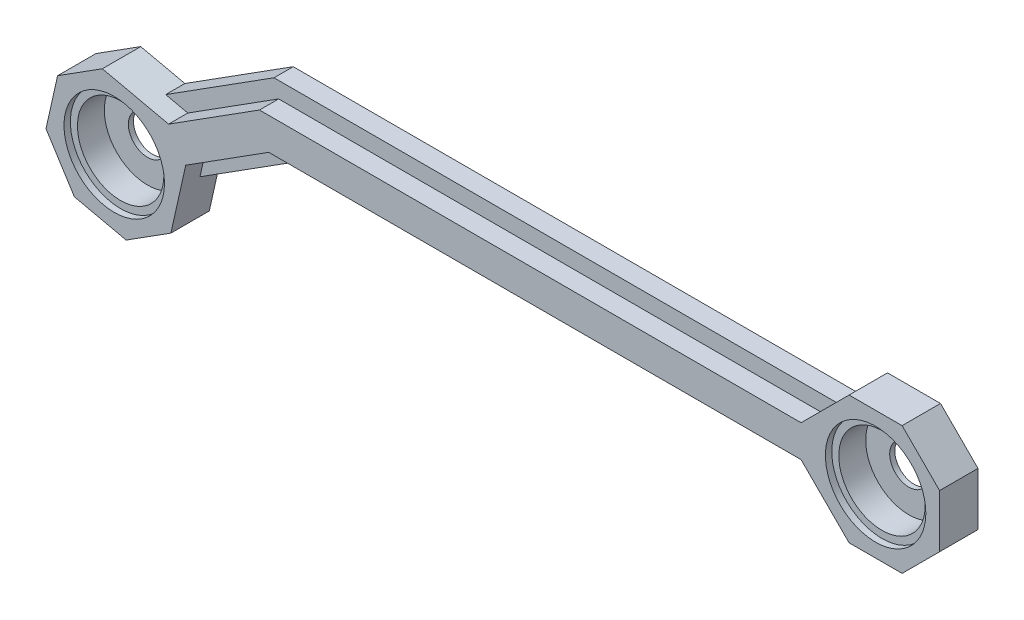
ISO-10303-21;
HEADER;
FILE_DESCRIPTION(('STEP AP214'),'2;1');
FILE_NAME('part.step','',(''),(''),'','','');
FILE_SCHEMA(('AUTOMOTIVE_DESIGN { 1 0 10303 214 1 1 1 1 }'));
ENDSEC;
DATA;
#1=APPLICATION_CONTEXT('core data for automotive mechanical design processes');
#2=APPLICATION_PROTOCOL_DEFINITION('international standard','automotive_design',2000,#1);
#3=PRODUCT_CONTEXT('',#1,'mechanical');
#4=PRODUCT('Part','Part','',(#3));
#5=PRODUCT_RELATED_PRODUCT_CATEGORY('part','',(#4));
#6=PRODUCT_DEFINITION_FORMATION('','',#4);
#7=PRODUCT_DEFINITION_CONTEXT('part definition',#1,'design');
#8=PRODUCT_DEFINITION('design','',#6,#7);
#9=PRODUCT_DEFINITION_SHAPE('','',#8);
#10=(LENGTH_UNIT() NAMED_UNIT(*) SI_UNIT(.MILLI.,.METRE.));
#11=(NAMED_UNIT(*) PLANE_ANGLE_UNIT() SI_UNIT($,.RADIAN.));
#12=(NAMED_UNIT(*) SI_UNIT($,.STERADIAN.) SOLID_ANGLE_UNIT());
#13=UNCERTAINTY_MEASURE_WITH_UNIT(LENGTH_MEASURE(1.E-05),#10,'distance_accuracy_value','');
#14=(GEOMETRIC_REPRESENTATION_CONTEXT(3) GLOBAL_UNCERTAINTY_ASSIGNED_CONTEXT((#13)) GLOBAL_UNIT_ASSIGNED_CONTEXT((#10,
#11,#12)) REPRESENTATION_CONTEXT('',''));
#15=CARTESIAN_POINT('',(0.,0.,0.));
#16=DIRECTION('',(0.,0.,1.));
#17=DIRECTION('',(1.,0.,0.));
#18=AXIS2_PLACEMENT_3D('',#15,#16,#17);
#19=CARTESIAN_POINT('',(-97.0021611343395,4.99999999999999,-3.));
#20=DIRECTION('',(-0.535679423795969,0.84442143205962,0.));
#21=DIRECTION('',(-0.84442143205962,-0.535679423795969,0.));
#22=AXIS2_PLACEMENT_3D('',#19,#20,#21);
#23=PLANE('',#22);
#24=DIRECTION('',(0.,0.,1.));
#25=VECTOR('',#24,1.);
#26=CARTESIAN_POINT('',(-113.924993650639,-5.7354134169905,-3.));
#27=LINE('',#26,#25);
#28=CARTESIAN_POINT('',(-113.924993650639,-5.73541341699053,-6.));
#29=VERTEX_POINT('',#28);
#30=CARTESIAN_POINT('',(-113.924993650639,-5.73541341699053,-3.));
#31=VERTEX_POINT('',#30);
#32=EDGE_CURVE('E396',#29,#31,#27,.T.);
#33=ORIENTED_EDGE('',*,*,#32,.T.);
#34=DIRECTION('',(-0.844421432059619,-0.535679423795969,0.));
#35=VECTOR('',#34,1.);
#36=CARTESIAN_POINT('',(-30.0967032462192,47.4431163985229,-3.));
#37=LINE('',#36,#35);
#38=CARTESIAN_POINT('',(-97.0021611343395,4.99999999999999,-3.));
#39=VERTEX_POINT('',#38);
#40=EDGE_CURVE('E307',#39,#31,#37,.T.);
#41=ORIENTED_EDGE('',*,*,#40,.F.);
#42=DIRECTION('',(0.,0.,1.));
#43=VECTOR('',#42,1.);
#44=CARTESIAN_POINT('',(-97.0021611343395,4.99999999999999,-3.));
#45=LINE('',#44,#43);
#46=CARTESIAN_POINT('',(-97.0021611343395,4.99999999999999,-6.));
#47=VERTEX_POINT('',#46);
#48=EDGE_CURVE('E404',#47,#39,#45,.T.);
#49=ORIENTED_EDGE('',*,*,#48,.F.);
#50=DIRECTION('',(0.844421432059619,0.53567942379597,0.));
#51=VECTOR('',#50,1.);
#52=CARTESIAN_POINT('',(-113.924993650639,-5.73541341699053,-6.));
#53=LINE('',#52,#51);
#54=EDGE_CURVE('E346',#29,#47,#53,.T.);
#55=ORIENTED_EDGE('',*,*,#54,.F.);
#56=EDGE_LOOP('',(#33,#41,#49,#55));
#57=FACE_BOUND('',#56,.T.);
#58=ADVANCED_FACE('F91',(#57),#23,.T.);
#59=CARTESIAN_POINT('',(-9.14213562373094,5.00000000000001,-3.));
#60=DIRECTION('',(0.,1.,0.));
#61=DIRECTION('',(-1.,0.,0.));
#62=AXIS2_PLACEMENT_3D('',#59,#60,#61);
#63=PLANE('',#62);
#64=ORIENTED_EDGE('',*,*,#48,.T.);
#65=DIRECTION('',(-1.,0.,0.));
#66=VECTOR('',#65,1.);
#67=CARTESIAN_POINT('',(0.,5.,-3.));
#68=LINE('',#67,#66);
#69=CARTESIAN_POINT('',(-9.14213562373094,5.00000000000001,-3.));
#70=VERTEX_POINT('',#69);
#71=EDGE_CURVE('E304',#70,#39,#68,.T.);
#72=ORIENTED_EDGE('',*,*,#71,.F.);
#73=DIRECTION('',(0.,0.,1.));
#74=VECTOR('',#73,1.);
#75=CARTESIAN_POINT('',(-9.14213562373094,5.00000000000001,-3.));
#76=LINE('',#75,#74);
#77=CARTESIAN_POINT('',(-9.14213562373094,5.,-6.));
#78=VERTEX_POINT('',#77);
#79=EDGE_CURVE('E409',#78,#70,#76,.T.);
#80=ORIENTED_EDGE('',*,*,#79,.F.);
#81=DIRECTION('',(1.,0.,0.));
#82=VECTOR('',#81,1.);
#83=CARTESIAN_POINT('',(-97.0021611343395,4.99999999999999,-6.));
#84=LINE('',#83,#82);
#85=EDGE_CURVE('E336',#47,#78,#84,.T.);
#86=ORIENTED_EDGE('',*,*,#85,.F.);
#87=EDGE_LOOP('',(#64,#72,#80,#86));
#88=FACE_BOUND('',#87,.T.);
#89=ADVANCED_FACE('F586',(#88),#63,.T.);
#90=CARTESIAN_POINT('',(-94.0978388656604,-4.99999999999999,-3.));
#91=DIRECTION('',(0.535679423795973,-0.844421432059617,0.));
#92=DIRECTION('',(0.844421432059617,0.535679423795973,0.));
#93=AXIS2_PLACEMENT_3D('',#90,#91,#92);
#94=PLANE('',#93);
#95=DIRECTION('',(0.,0.,1.));
#96=VECTOR('',#95,1.);
#97=CARTESIAN_POINT('',(-94.0978388656604,-4.99999999999999,-3.));
#98=LINE('',#97,#96);
#99=CARTESIAN_POINT('',(-94.0978388656604,-4.99999999999999,-6.));
#100=VERTEX_POINT('',#99);
#101=CARTESIAN_POINT('',(-94.0978388656604,-4.99999999999999,-3.));
#102=VERTEX_POINT('',#101);
#103=EDGE_CURVE('E391',#100,#102,#98,.T.);
#104=ORIENTED_EDGE('',*,*,#103,.T.);
#105=DIRECTION('',(0.844421432059617,0.535679423795973,0.));
#106=VECTOR('',#105,1.);
#107=CARTESIAN_POINT('',(-24.7399090082598,38.9989020779268,-3.));
#108=LINE('',#107,#106);
#109=CARTESIAN_POINT('',(-108.56819941268,-14.1796277375867,-3.));
#110=VERTEX_POINT('',#109);
#111=EDGE_CURVE('E117',#110,#102,#108,.T.);
#112=ORIENTED_EDGE('',*,*,#111,.F.);
#113=DIRECTION('',(0.,0.,1.));
#114=VECTOR('',#113,1.);
#115=CARTESIAN_POINT('',(-108.56819941268,-14.1796277375867,-3.));
#116=LINE('',#115,#114);
#117=CARTESIAN_POINT('',(-108.56819941268,-14.1796277375867,-6.));
#118=VERTEX_POINT('',#117);
#119=EDGE_CURVE('E392',#118,#110,#116,.T.);
#120=ORIENTED_EDGE('',*,*,#119,.F.);
#121=DIRECTION('',(-0.844421432059617,-0.535679423795973,0.));
#122=VECTOR('',#121,1.);
#123=CARTESIAN_POINT('',(-108.56819941268,-14.1796277375867,-6.));
#124=LINE('',#123,#122);
#125=EDGE_CURVE('E354',#100,#118,#124,.T.);
#126=ORIENTED_EDGE('',*,*,#125,.F.);
#127=EDGE_LOOP('',(#104,#112,#120,#126));
#128=FACE_BOUND('',#127,.T.);
#129=ADVANCED_FACE('F592',(#128),#94,.T.);
#130=CARTESIAN_POINT('',(-9.14213562373094,-5.00000000000001,-3.));
#131=DIRECTION('',(0.,-1.,0.));
#132=DIRECTION('',(1.,0.,0.));
#133=AXIS2_PLACEMENT_3D('',#130,#131,#132);
#134=PLANE('',#133);
#135=DIRECTION('',(0.,0.,1.));
#136=VECTOR('',#135,1.);
#137=CARTESIAN_POINT('',(-9.14213562373094,-5.00000000000001,-3.));
#138=LINE('',#137,#136);
#139=CARTESIAN_POINT('',(-9.14213562373094,-5.,-6.));
#140=VERTEX_POINT('',#139);
#141=CARTESIAN_POINT('',(-9.14213562373094,-5.,-3.));
#142=VERTEX_POINT('',#141);
#143=EDGE_CURVE('E397',#140,#142,#138,.T.);
#144=ORIENTED_EDGE('',*,*,#143,.T.);
#145=DIRECTION('',(1.,0.,0.));
#146=VECTOR('',#145,1.);
#147=CARTESIAN_POINT('',(0.,-5.00000000000001,-3.));
#148=LINE('',#147,#146);
#149=EDGE_CURVE('E291',#102,#142,#148,.T.);
#150=ORIENTED_EDGE('',*,*,#149,.F.);
#151=ORIENTED_EDGE('',*,*,#103,.F.);
#152=DIRECTION('',(-1.,0.,0.));
#153=VECTOR('',#152,1.);
#154=CARTESIAN_POINT('',(-94.0978388656604,-4.99999999999999,-6.));
#155=LINE('',#154,#153);
#156=EDGE_CURVE('E350',#140,#100,#155,.T.);
#157=ORIENTED_EDGE('',*,*,#156,.F.);
#158=EDGE_LOOP('',(#144,#150,#151,#157));
#159=FACE_BOUND('',#158,.T.);
#160=ADVANCED_FACE('F634',(#159),#134,.T.);
#161=CARTESIAN_POINT('',(-6.65167371830106,-29.7335002875948,-6.));
#162=DIRECTION('',(-0.218313567680371,-0.975878673896847,0.));
#163=DIRECTION('',(0.975878673896847,-0.218313567680371,0.));
#164=AXIS2_PLACEMENT_3D('',#161,#162,#163);
#165=PLANE('',#164);
#166=ORIENTED_EDGE('',*,*,#32,.F.);
#167=DIRECTION('',(0.975878673896847,-0.218313567680371,0.));
#168=VECTOR('',#167,1.);
#169=CARTESIAN_POINT('',(-6.65167371830106,-29.7335002875948,-6.));
#170=LINE('',#169,#168);
#171=CARTESIAN_POINT('',(-120.825497929917,-4.19170337567234,-6.));
#172=VERTEX_POINT('',#171);
#173=EDGE_CURVE('E445',#172,#29,#170,.T.);
#174=ORIENTED_EDGE('',*,*,#173,.F.);
#175=DIRECTION('',(0.,0.,1.));
#176=VECTOR('',#175,1.);
#177=CARTESIAN_POINT('',(-120.825497929917,-4.19170337567234,-6.));
#178=LINE('',#177,#176);
#179=CARTESIAN_POINT('',(-120.825497929917,-4.19170337567234,0.));
#180=VERTEX_POINT('',#179);
#181=EDGE_CURVE('E535',#172,#180,#178,.T.);
#182=ORIENTED_EDGE('',*,*,#181,.T.);
#183=DIRECTION('',(0.975878673896847,-0.218313567680371,0.));
#184=VECTOR('',#183,1.);
#185=CARTESIAN_POINT('',(-6.65167371830106,-29.7335002875948,0.));
#186=LINE('',#185,#184);
#187=CARTESIAN_POINT('',(-110.474741511,-6.50726843764966,0.));
#188=VERTEX_POINT('',#187);
#189=EDGE_CURVE('E499',#180,#188,#186,.T.);
#190=ORIENTED_EDGE('',*,*,#189,.T.);
#191=DIRECTION('',(0.,0.,1.));
#192=VECTOR('',#191,1.);
#193=CARTESIAN_POINT('',(-110.474741511,-6.50726843764966,-3.));
#194=LINE('',#193,#192);
#195=CARTESIAN_POINT('',(-110.474741511,-6.50726843764966,-3.));
#196=VERTEX_POINT('',#195);
#197=EDGE_CURVE('E325',#196,#188,#194,.T.);
#198=ORIENTED_EDGE('',*,*,#197,.F.);
#199=DIRECTION('',(0.975878673896847,-0.218313567680371,0.));
#200=VECTOR('',#199,1.);
#201=CARTESIAN_POINT('',(-6.65167371830105,-29.7335002875948,-3.));
#202=LINE('',#201,#200);
#203=EDGE_CURVE('E312',#31,#196,#202,.T.);
#204=ORIENTED_EDGE('',*,*,#203,.F.);
#205=EDGE_LOOP('',(#166,#174,#182,#190,#198,#204));
#206=FACE_BOUND('',#205,.T.);
#207=ADVANCED_FACE('F631',(#206),#165,.F.);
#208=CARTESIAN_POINT('',(-7.07106781186547,7.07106781186547,-6.));
#209=DIRECTION('',(-0.707106781186547,0.707106781186547,0.));
#210=DIRECTION('',(-0.707106781186548,-0.707106781186548,0.));
#211=AXIS2_PLACEMENT_3D('',#208,#209,#210);
#212=PLANE('',#211);
#213=DIRECTION('',(-0.707106781186548,-0.707106781186548,0.));
#214=VECTOR('',#213,1.);
#215=CARTESIAN_POINT('',(-7.07106781186547,7.07106781186547,-6.));
#216=LINE('',#215,#214);
#217=CARTESIAN_POINT('',(-4.14213562373094,9.99999999999999,-6.));
#218=VERTEX_POINT('',#217);
#219=EDGE_CURVE('E441',#218,#78,#216,.T.);
#220=ORIENTED_EDGE('',*,*,#219,.T.);
#221=ORIENTED_EDGE('',*,*,#79,.T.);
#222=DIRECTION('',(0.707106781186548,0.707106781186547,0.));
#223=VECTOR('',#222,1.);
#224=CARTESIAN_POINT('',(-7.07106781186547,7.07106781186547,-3.));
#225=LINE('',#224,#223);
#226=CARTESIAN_POINT('',(-11.6421356237309,2.5,-3.));
#227=VERTEX_POINT('',#226);
#228=EDGE_CURVE('E109',#227,#70,#225,.T.);
#229=ORIENTED_EDGE('',*,*,#228,.F.);
#230=DIRECTION('',(0.,0.,1.));
#231=VECTOR('',#230,1.);
#232=CARTESIAN_POINT('',(-11.6421356237309,2.5,-3.));
#233=LINE('',#232,#231);
#234=CARTESIAN_POINT('',(-11.6421356237309,2.5,0.));
#235=VERTEX_POINT('',#234);
#236=EDGE_CURVE('E332',#227,#235,#233,.T.);
#237=ORIENTED_EDGE('',*,*,#236,.T.);
#238=DIRECTION('',(-0.707106781186548,-0.707106781186548,0.));
#239=VECTOR('',#238,1.);
#240=CARTESIAN_POINT('',(-7.07106781186547,7.07106781186547,0.));
#241=LINE('',#240,#239);
#242=CARTESIAN_POINT('',(-4.14213562373094,9.99999999999999,0.));
#243=VERTEX_POINT('',#242);
#244=EDGE_CURVE('E496',#243,#235,#241,.T.);
#245=ORIENTED_EDGE('',*,*,#244,.F.);
#246=DIRECTION('',(0.,0.,1.));
#247=VECTOR('',#246,1.);
#248=CARTESIAN_POINT('',(-4.14213562373094,9.99999999999999,-6.));
#249=LINE('',#248,#247);
#250=EDGE_CURVE('E538',#218,#243,#249,.T.);
#251=ORIENTED_EDGE('',*,*,#250,.F.);
#252=EDGE_LOOP('',(#220,#221,#229,#237,#245,#251));
#253=FACE_BOUND('',#252,.T.);
#254=ADVANCED_FACE('F609',(#253),#212,.T.);
#255=CARTESIAN_POINT('',(-100.372815653061,22.4543768292855,-6.));
#256=DIRECTION('',(0.975878673896848,-0.218313567680365,0.));
#257=DIRECTION('',(0.218313567680365,0.975878673896848,0.));
#258=AXIS2_PLACEMENT_3D('',#255,#256,#257);
#259=PLANE('',#258);
#260=DIRECTION('',(0.218313567680365,0.975878673896848,0.));
#261=VECTOR('',#260,1.);
#262=CARTESIAN_POINT('',(-100.372815653061,22.4543768292855,-6.));
#263=LINE('',#262,#261);
#264=CARTESIAN_POINT('',(-110.111909453998,-21.0801320168647,-6.));
#265=VERTEX_POINT('',#264);
#266=EDGE_CURVE('E469',#265,#118,#263,.T.);
#267=ORIENTED_EDGE('',*,*,#266,.T.);
#268=ORIENTED_EDGE('',*,*,#119,.T.);
#269=DIRECTION('',(-0.21831356768039,-0.975878673896842,0.));
#270=VECTOR('',#269,1.);
#271=CARTESIAN_POINT('',(-100.372815653059,22.4543768292879,-3.));
#272=LINE('',#271,#270);
#273=CARTESIAN_POINT('',(-107.79634439202,-10.7293755979477,-3.));
#274=VERTEX_POINT('',#273);
#275=EDGE_CURVE('E277',#274,#110,#272,.T.);
#276=ORIENTED_EDGE('',*,*,#275,.F.);
#277=DIRECTION('',(0.,0.,1.));
#278=VECTOR('',#277,1.);
#279=CARTESIAN_POINT('',(-107.79634439202,-10.7293755979477,-3.));
#280=LINE('',#279,#278);
#281=CARTESIAN_POINT('',(-107.79634439202,-10.7293755979477,0.));
#282=VERTEX_POINT('',#281);
#283=EDGE_CURVE('E268',#274,#282,#280,.T.);
#284=ORIENTED_EDGE('',*,*,#283,.T.);
#285=DIRECTION('',(0.218313567680365,0.975878673896848,0.));
#286=VECTOR('',#285,1.);
#287=CARTESIAN_POINT('',(-100.372815653061,22.4543768292855,0.));
#288=LINE('',#287,#286);
#289=CARTESIAN_POINT('',(-110.111909453998,-21.0801320168647,0.));
#290=VERTEX_POINT('',#289);
#291=EDGE_CURVE('E421',#290,#282,#288,.T.);
#292=ORIENTED_EDGE('',*,*,#291,.F.);
#293=DIRECTION('',(0.,0.,1.));
#294=VECTOR('',#293,1.);
#295=CARTESIAN_POINT('',(-110.111909453998,-21.0801320168647,-6.));
#296=LINE('',#295,#294);
#297=EDGE_CURVE('E12',#265,#290,#296,.T.);
#298=ORIENTED_EDGE('',*,*,#297,.F.);
#299=EDGE_LOOP('',(#267,#268,#276,#284,#292,#298));
#300=FACE_BOUND('',#299,.T.);
#301=ADVANCED_FACE('F583',(#300),#259,.T.);
#302=CARTESIAN_POINT('',(-7.07106781186547,-7.07106781186547,-6.));
#303=DIRECTION('',(0.707106781186548,0.707106781186547,0.));
#304=DIRECTION('',(-0.707106781186547,0.707106781186548,0.));
#305=AXIS2_PLACEMENT_3D('',#302,#303,#304);
#306=PLANE('',#305);
#307=ORIENTED_EDGE('',*,*,#143,.F.);
#308=DIRECTION('',(-0.707106781186547,0.707106781186548,0.));
#309=VECTOR('',#308,1.);
#310=CARTESIAN_POINT('',(-7.07106781186547,-7.07106781186547,-6.));
#311=LINE('',#310,#309);
#312=CARTESIAN_POINT('',(-4.14213562373095,-9.99999999999999,-6.));
#313=VERTEX_POINT('',#312);
#314=EDGE_CURVE('E416',#313,#140,#311,.T.);
#315=ORIENTED_EDGE('',*,*,#314,.F.);
#316=DIRECTION('',(0.,0.,1.));
#317=VECTOR('',#316,1.);
#318=CARTESIAN_POINT('',(-4.14213562373095,-9.99999999999999,-6.));
#319=LINE('',#318,#317);
#320=CARTESIAN_POINT('',(-4.14213562373095,-9.99999999999999,0.));
#321=VERTEX_POINT('',#320);
#322=EDGE_CURVE('E473',#313,#321,#319,.T.);
#323=ORIENTED_EDGE('',*,*,#322,.T.);
#324=DIRECTION('',(-0.707106781186547,0.707106781186548,0.));
#325=VECTOR('',#324,1.);
#326=CARTESIAN_POINT('',(-7.07106781186547,-7.07106781186547,0.));
#327=LINE('',#326,#325);
#328=CARTESIAN_POINT('',(-11.6421356237309,-2.5,0.));
#329=VERTEX_POINT('',#328);
#330=EDGE_CURVE('E408',#321,#329,#327,.T.);
#331=ORIENTED_EDGE('',*,*,#330,.T.);
#332=DIRECTION('',(0.,0.,1.));
#333=VECTOR('',#332,1.);
#334=CARTESIAN_POINT('',(-11.6421356237309,-2.5,-3.));
#335=LINE('',#334,#333);
#336=CARTESIAN_POINT('',(-11.6421356237309,-2.5,-3.));
#337=VERTEX_POINT('',#336);
#338=EDGE_CURVE('E298',#337,#329,#335,.T.);
#339=ORIENTED_EDGE('',*,*,#338,.F.);
#340=DIRECTION('',(-0.707106781186548,0.707106781186548,0.));
#341=VECTOR('',#340,1.);
#342=CARTESIAN_POINT('',(-7.07106781186547,-7.07106781186547,-3.));
#343=LINE('',#342,#341);
#344=EDGE_CURVE('E269',#142,#337,#343,.T.);
#345=ORIENTED_EDGE('',*,*,#344,.F.);
#346=EDGE_LOOP('',(#307,#315,#323,#331,#339,#345));
#347=FACE_BOUND('',#346,.T.);
#348=ADVANCED_FACE('F574',(#347),#306,.F.);
#349=CARTESIAN_POINT('',(-118.966411787134,-14.8547745204735,-6.));
#350=DIRECTION('',(0.,0.,1.));
#351=DIRECTION('',(1.,0.,0.));
#352=AXIS2_PLACEMENT_3D('',#349,#350,#351);
#353=CYLINDRICAL_SURFACE('',#352,3.00000000000001);
#354=CARTESIAN_POINT('',(-118.966411787134,-14.8547745204735,-6.));
#355=DIRECTION('',(0.,0.,-1.));
#356=DIRECTION('',(-1.,0.,0.));
#357=AXIS2_PLACEMENT_3D('',#354,#355,#356);
#358=CIRCLE('',#357,3.00000000000001);
#359=CARTESIAN_POINT('',(-121.966411787134,-14.8547745204735,-6.));
#360=VERTEX_POINT('',#359);
#361=EDGE_CURVE('E371',#360,#360,#358,.T.);
#362=ORIENTED_EDGE('',*,*,#361,.T.);
#363=EDGE_LOOP('',(#362));
#364=FACE_BOUND('',#363,.T.);
#365=CARTESIAN_POINT('',(-118.966411787134,-14.8547745204735,-5.2));
#366=DIRECTION('',(0.,0.,1.));
#367=DIRECTION('',(1.,0.,0.));
#368=AXIS2_PLACEMENT_3D('',#365,#366,#367);
#369=CIRCLE('',#368,3.00000000000001);
#370=CARTESIAN_POINT('',(-115.966411787134,-14.8547745204735,-5.2));
#371=VERTEX_POINT('',#370);
#372=EDGE_CURVE('E95',#371,#371,#369,.F.);
#373=ORIENTED_EDGE('',*,*,#372,.F.);
#374=EDGE_LOOP('',(#373));
#375=FACE_BOUND('',#374,.T.);
#376=ADVANCED_FACE('F93',(#364,#375),#353,.F.);
#377=CARTESIAN_POINT('',(0.,0.,-0.8));
#378=DIRECTION('',(0.,0.,1.));
#379=DIRECTION('',(1.,0.,0.));
#380=AXIS2_PLACEMENT_3D('',#377,#378,#379);
#381=CYLINDRICAL_SURFACE('',#380,3.);
#382=CARTESIAN_POINT('',(0.,0.,-6.));
#383=DIRECTION('',(0.,0.,-1.));
#384=DIRECTION('',(-1.,0.,0.));
#385=AXIS2_PLACEMENT_3D('',#382,#383,#384);
#386=CIRCLE('',#385,3.);
#387=CARTESIAN_POINT('',(-3.,0.,-6.));
#388=VERTEX_POINT('',#387);
#389=EDGE_CURVE('E387',#388,#388,#386,.T.);
#390=ORIENTED_EDGE('',*,*,#389,.T.);
#391=EDGE_LOOP('',(#390));
#392=FACE_BOUND('',#391,.T.);
#393=CARTESIAN_POINT('',(0.,0.,-5.2));
#394=DIRECTION('',(0.,0.,1.));
#395=DIRECTION('',(1.,0.,0.));
#396=AXIS2_PLACEMENT_3D('',#393,#394,#395);
#397=CIRCLE('',#396,3.);
#398=CARTESIAN_POINT('',(3.,0.,-5.2));
#399=VERTEX_POINT('',#398);
#400=EDGE_CURVE('E561',#399,#399,#397,.F.);
#401=ORIENTED_EDGE('',*,*,#400,.F.);
#402=EDGE_LOOP('',(#401));
#403=FACE_BOUND('',#402,.T.);
#404=ADVANCED_FACE('F573',(#392,#403),#381,.F.);
#405=CARTESIAN_POINT('',(-22.0615118892795,34.7767949176284,-6.));
#406=DIRECTION('',(0.535679423795969,-0.84442143205962,0.));
#407=DIRECTION('',(0.84442143205962,0.535679423795969,0.));
#408=AXIS2_PLACEMENT_3D('',#405,#406,#407);
#409=PLANE('',#408);
#410=DIRECTION('',(0.84442143205962,0.535679423795969,0.));
#411=VECTOR('',#410,1.);
#412=CARTESIAN_POINT('',(-22.0615118892795,34.7767949176284,0.));
#413=LINE('',#412,#411);
#414=CARTESIAN_POINT('',(-117.10732564435,-25.5178456652746,0.));
#415=VERTEX_POINT('',#414);
#416=EDGE_CURVE('E518',#415,#290,#413,.T.);
#417=ORIENTED_EDGE('',*,*,#416,.F.);
#418=DIRECTION('',(0.,0.,1.));
#419=VECTOR('',#418,1.);
#420=CARTESIAN_POINT('',(-117.10732564435,-25.5178456652746,-6.));
#421=LINE('',#420,#419);
#422=CARTESIAN_POINT('',(-117.10732564435,-25.5178456652746,-6.));
#423=VERTEX_POINT('',#422);
#424=EDGE_CURVE('E101',#423,#415,#421,.T.);
#425=ORIENTED_EDGE('',*,*,#424,.F.);
#426=DIRECTION('',(0.84442143205962,0.535679423795969,0.));
#427=VECTOR('',#426,1.);
#428=CARTESIAN_POINT('',(-22.0615118892795,34.7767949176284,-6.));
#429=LINE('',#428,#427);
#430=EDGE_CURVE('E465',#423,#265,#429,.T.);
#431=ORIENTED_EDGE('',*,*,#430,.T.);
#432=ORIENTED_EDGE('',*,*,#297,.T.);
#433=EDGE_LOOP('',(#417,#425,#431,#432));
#434=FACE_BOUND('',#433,.T.);
#435=ADVANCED_FACE('F580',(#434),#409,.T.);
#436=CARTESIAN_POINT('',(-11.0179450719085,-49.2510737655318,-6.));
#437=DIRECTION('',(-0.218313567680371,-0.975878673896847,0.));
#438=DIRECTION('',(0.975878673896847,-0.218313567680371,0.));
#439=AXIS2_PLACEMENT_3D('',#436,#437,#438);
#440=PLANE('',#439);
#441=DIRECTION('',(0.975878673896847,-0.218313567680371,0.));
#442=VECTOR('',#441,1.);
#443=CARTESIAN_POINT('',(-11.0179450719085,-49.2510737655318,0.));
#444=LINE('',#443,#442);
#445=CARTESIAN_POINT('',(-125.191769283525,-23.7092768536093,0.));
#446=VERTEX_POINT('',#445);
#447=EDGE_CURVE('E514',#446,#415,#444,.T.);
#448=ORIENTED_EDGE('',*,*,#447,.F.);
#449=DIRECTION('',(0.,0.,1.));
#450=VECTOR('',#449,1.);
#451=CARTESIAN_POINT('',(-125.191769283525,-23.7092768536093,-6.));
#452=LINE('',#451,#450);
#453=CARTESIAN_POINT('',(-125.191769283525,-23.7092768536093,-6.));
#454=VERTEX_POINT('',#453);
#455=EDGE_CURVE('E526',#454,#446,#452,.T.);
#456=ORIENTED_EDGE('',*,*,#455,.F.);
#457=DIRECTION('',(0.975878673896847,-0.218313567680371,0.));
#458=VECTOR('',#457,1.);
#459=CARTESIAN_POINT('',(-11.0179450719085,-49.2510737655318,-6.));
#460=LINE('',#459,#458);
#461=EDGE_CURVE('E461',#454,#423,#460,.T.);
#462=ORIENTED_EDGE('',*,*,#461,.T.);
#463=ORIENTED_EDGE('',*,*,#424,.T.);
#464=EDGE_LOOP('',(#448,#456,#462,#463));
#465=FACE_BOUND('',#464,.T.);
#466=ADVANCED_FACE('F613',(#465),#440,.T.);
#467=CARTESIAN_POINT('',(-99.9923199804895,-63.4325779966584,-6.));
#468=DIRECTION('',(-0.844421432059615,-0.535679423795976,0.));
#469=DIRECTION('',(0.535679423795977,-0.844421432059615,0.));
#470=AXIS2_PLACEMENT_3D('',#467,#468,#469);
#471=PLANE('',#470);
#472=DIRECTION('',(0.535679423795976,-0.844421432059615,0.));
#473=VECTOR('',#472,1.);
#474=CARTESIAN_POINT('',(-99.9923199804895,-63.4325779966584,0.));
#475=LINE('',#474,#473);
#476=CARTESIAN_POINT('',(-129.629482931935,-16.7138606632572,0.));
#477=VERTEX_POINT('',#476);
#478=EDGE_CURVE('E510',#477,#446,#475,.T.);
#479=ORIENTED_EDGE('',*,*,#478,.F.);
#480=DIRECTION('',(0.,0.,1.));
#481=VECTOR('',#480,1.);
#482=CARTESIAN_POINT('',(-129.629482931935,-16.7138606632572,-6.));
#483=LINE('',#482,#481);
#484=CARTESIAN_POINT('',(-129.629482931935,-16.7138606632572,-6.));
#485=VERTEX_POINT('',#484);
#486=EDGE_CURVE('E529',#485,#477,#483,.T.);
#487=ORIENTED_EDGE('',*,*,#486,.F.);
#488=DIRECTION('',(0.535679423795976,-0.844421432059615,0.));
#489=VECTOR('',#488,1.);
#490=CARTESIAN_POINT('',(-99.9923199804895,-63.4325779966584,-6.));
#491=LINE('',#490,#489);
#492=EDGE_CURVE('E457',#485,#454,#491,.T.);
#493=ORIENTED_EDGE('',*,*,#492,.T.);
#494=ORIENTED_EDGE('',*,*,#455,.T.);
#495=EDGE_LOOP('',(#479,#487,#493,#494));
#496=FACE_BOUND('',#495,.T.);
#497=ADVANCED_FACE('F617',(#496),#471,.T.);
#498=CARTESIAN_POINT('',(-119.890389130997,26.8206481828934,-6.));
#499=DIRECTION('',(-0.975878673896847,0.21831356768037,0.));
#500=DIRECTION('',(-0.21831356768037,-0.975878673896847,0.));
#501=AXIS2_PLACEMENT_3D('',#498,#499,#500);
#502=PLANE('',#501);
#503=DIRECTION('',(-0.21831356768037,-0.975878673896847,0.));
#504=VECTOR('',#503,1.);
#505=CARTESIAN_POINT('',(-119.890389130997,26.8206481828934,0.));
#506=LINE('',#505,#504);
#507=CARTESIAN_POINT('',(-127.820914120269,-8.62941702408226,0.));
#508=VERTEX_POINT('',#507);
#509=EDGE_CURVE('E506',#508,#477,#506,.T.);
#510=ORIENTED_EDGE('',*,*,#509,.F.);
#511=DIRECTION('',(0.,0.,1.));
#512=VECTOR('',#511,1.);
#513=CARTESIAN_POINT('',(-127.820914120269,-8.62941702408226,-6.));
#514=LINE('',#513,#512);
#515=CARTESIAN_POINT('',(-127.820914120269,-8.62941702408226,-6.));
#516=VERTEX_POINT('',#515);
#517=EDGE_CURVE('E532',#516,#508,#514,.T.);
#518=ORIENTED_EDGE('',*,*,#517,.F.);
#519=DIRECTION('',(-0.21831356768037,-0.975878673896847,0.));
#520=VECTOR('',#519,1.);
#521=CARTESIAN_POINT('',(-119.890389130997,26.8206481828934,-6.));
#522=LINE('',#521,#520);
#523=EDGE_CURVE('E453',#516,#485,#522,.T.);
#524=ORIENTED_EDGE('',*,*,#523,.T.);
#525=ORIENTED_EDGE('',*,*,#486,.T.);
#526=EDGE_LOOP('',(#510,#518,#524,#525));
#527=FACE_BOUND('',#526,.T.);
#528=ADVANCED_FACE('F621',(#527),#502,.T.);
#529=CARTESIAN_POINT('',(-32.7751003651998,51.6652235588213,-6.));
#530=DIRECTION('',(-0.535679423795975,0.844421432059615,0.));
#531=DIRECTION('',(-0.844421432059616,-0.535679423795975,0.));
#532=AXIS2_PLACEMENT_3D('',#529,#530,#531);
#533=PLANE('',#532);
#534=DIRECTION('',(-0.844421432059616,-0.535679423795975,0.));
#535=VECTOR('',#534,1.);
#536=CARTESIAN_POINT('',(-32.7751003651998,51.6652235588213,0.));
#537=LINE('',#536,#535);
#538=EDGE_CURVE('E502',#180,#508,#537,.T.);
#539=ORIENTED_EDGE('',*,*,#538,.F.);
#540=ORIENTED_EDGE('',*,*,#181,.F.);
#541=DIRECTION('',(-0.844421432059616,-0.535679423795975,0.));
#542=VECTOR('',#541,1.);
#543=CARTESIAN_POINT('',(-32.7751003651998,51.6652235588213,-6.));
#544=LINE('',#543,#542);
#545=EDGE_CURVE('E449',#172,#516,#544,.T.);
#546=ORIENTED_EDGE('',*,*,#545,.T.);
#547=ORIENTED_EDGE('',*,*,#517,.T.);
#548=EDGE_LOOP('',(#539,#540,#546,#547));
#549=FACE_BOUND('',#548,.T.);
#550=ADVANCED_FACE('F625',(#549),#533,.T.);
#551=CARTESIAN_POINT('',(0.,9.99999999999999,-6.));
#552=DIRECTION('',(0.,1.,0.));
#553=DIRECTION('',(-1.,0.,0.));
#554=AXIS2_PLACEMENT_3D('',#551,#552,#553);
#555=PLANE('',#554);
#556=DIRECTION('',(-1.,0.,0.));
#557=VECTOR('',#556,1.);
#558=CARTESIAN_POINT('',(0.,9.99999999999999,0.));
#559=LINE('',#558,#557);
#560=CARTESIAN_POINT('',(4.14213562373095,9.99999999999999,0.));
#561=VERTEX_POINT('',#560);
#562=EDGE_CURVE('E492',#561,#243,#559,.T.);
#563=ORIENTED_EDGE('',*,*,#562,.F.);
#564=DIRECTION('',(0.,0.,1.));
#565=VECTOR('',#564,1.);
#566=CARTESIAN_POINT('',(4.14213562373095,9.99999999999999,-6.));
#567=LINE('',#566,#565);
#568=CARTESIAN_POINT('',(4.14213562373095,9.99999999999999,-6.));
#569=VERTEX_POINT('',#568);
#570=EDGE_CURVE('E541',#569,#561,#567,.T.);
#571=ORIENTED_EDGE('',*,*,#570,.F.);
#572=DIRECTION('',(-1.,0.,0.));
#573=VECTOR('',#572,1.);
#574=CARTESIAN_POINT('',(0.,9.99999999999999,-6.));
#575=LINE('',#574,#573);
#576=EDGE_CURVE('E437',#569,#218,#575,.T.);
#577=ORIENTED_EDGE('',*,*,#576,.T.);
#578=ORIENTED_EDGE('',*,*,#250,.T.);
#579=EDGE_LOOP('',(#563,#571,#577,#578));
#580=FACE_BOUND('',#579,.T.);
#581=ADVANCED_FACE('F629',(#580),#555,.T.);
#582=CARTESIAN_POINT('',(7.07106781186547,7.07106781186547,-6.));
#583=DIRECTION('',(0.707106781186548,0.707106781186547,0.));
#584=DIRECTION('',(-0.707106781186547,0.707106781186548,0.));
#585=AXIS2_PLACEMENT_3D('',#582,#583,#584);
#586=PLANE('',#585);
#587=DIRECTION('',(-0.707106781186547,0.707106781186548,0.));
#588=VECTOR('',#587,1.);
#589=CARTESIAN_POINT('',(7.07106781186547,7.07106781186547,0.));
#590=LINE('',#589,#588);
#591=CARTESIAN_POINT('',(10.,4.14213562373094,0.));
#592=VERTEX_POINT('',#591);
#593=EDGE_CURVE('E488',#592,#561,#590,.T.);
#594=ORIENTED_EDGE('',*,*,#593,.F.);
#595=DIRECTION('',(0.,0.,1.));
#596=VECTOR('',#595,1.);
#597=CARTESIAN_POINT('',(10.,4.14213562373094,-6.));
#598=LINE('',#597,#596);
#599=CARTESIAN_POINT('',(10.,4.14213562373094,-6.));
#600=VERTEX_POINT('',#599);
#601=EDGE_CURVE('E544',#600,#592,#598,.T.);
#602=ORIENTED_EDGE('',*,*,#601,.F.);
#603=DIRECTION('',(-0.707106781186547,0.707106781186548,0.));
#604=VECTOR('',#603,1.);
#605=CARTESIAN_POINT('',(7.07106781186547,7.07106781186547,-6.));
#606=LINE('',#605,#604);
#607=EDGE_CURVE('E433',#600,#569,#606,.T.);
#608=ORIENTED_EDGE('',*,*,#607,.T.);
#609=ORIENTED_EDGE('',*,*,#570,.T.);
#610=EDGE_LOOP('',(#594,#602,#608,#609));
#611=FACE_BOUND('',#610,.T.);
#612=ADVANCED_FACE('F641',(#611),#586,.T.);
#613=CARTESIAN_POINT('',(10.,0.,-6.));
#614=DIRECTION('',(1.,0.,0.));
#615=DIRECTION('',(0.,1.,0.));
#616=AXIS2_PLACEMENT_3D('',#613,#614,#615);
#617=PLANE('',#616);
#618=DIRECTION('',(0.,1.,0.));
#619=VECTOR('',#618,1.);
#620=CARTESIAN_POINT('',(10.,0.,0.));
#621=LINE('',#620,#619);
#622=CARTESIAN_POINT('',(10.,-4.14213562373095,0.));
#623=VERTEX_POINT('',#622);
#624=EDGE_CURVE('E484',#623,#592,#621,.T.);
#625=ORIENTED_EDGE('',*,*,#624,.F.);
#626=DIRECTION('',(0.,0.,1.));
#627=VECTOR('',#626,1.);
#628=CARTESIAN_POINT('',(10.,-4.14213562373095,-6.));
#629=LINE('',#628,#627);
#630=CARTESIAN_POINT('',(10.,-4.14213562373095,-6.));
#631=VERTEX_POINT('',#630);
#632=EDGE_CURVE('E547',#631,#623,#629,.T.);
#633=ORIENTED_EDGE('',*,*,#632,.F.);
#634=DIRECTION('',(0.,1.,0.));
#635=VECTOR('',#634,1.);
#636=CARTESIAN_POINT('',(10.,0.,-6.));
#637=LINE('',#636,#635);
#638=EDGE_CURVE('E429',#631,#600,#637,.T.);
#639=ORIENTED_EDGE('',*,*,#638,.T.);
#640=ORIENTED_EDGE('',*,*,#601,.T.);
#641=EDGE_LOOP('',(#625,#633,#639,#640));
#642=FACE_BOUND('',#641,.T.);
#643=ADVANCED_FACE('F645',(#642),#617,.T.);
#644=CARTESIAN_POINT('',(7.07106781186547,-7.07106781186548,-6.));
#645=DIRECTION('',(0.707106781186547,-0.707106781186548,0.));
#646=DIRECTION('',(0.707106781186548,0.707106781186547,0.));
#647=AXIS2_PLACEMENT_3D('',#644,#645,#646);
#648=PLANE('',#647);
#649=DIRECTION('',(0.707106781186548,0.707106781186547,0.));
#650=VECTOR('',#649,1.);
#651=CARTESIAN_POINT('',(7.07106781186547,-7.07106781186548,0.));
#652=LINE('',#651,#650);
#653=CARTESIAN_POINT('',(4.14213562373095,-10.,0.));
#654=VERTEX_POINT('',#653);
#655=EDGE_CURVE('E480',#654,#623,#652,.T.);
#656=ORIENTED_EDGE('',*,*,#655,.F.);
#657=DIRECTION('',(0.,0.,1.));
#658=VECTOR('',#657,1.);
#659=CARTESIAN_POINT('',(4.14213562373095,-10.,-6.));
#660=LINE('',#659,#658);
#661=CARTESIAN_POINT('',(4.14213562373095,-10.,-6.));
#662=VERTEX_POINT('',#661);
#663=EDGE_CURVE('E550',#662,#654,#660,.T.);
#664=ORIENTED_EDGE('',*,*,#663,.F.);
#665=DIRECTION('',(0.707106781186548,0.707106781186547,0.));
#666=VECTOR('',#665,1.);
#667=CARTESIAN_POINT('',(7.07106781186547,-7.07106781186548,-6.));
#668=LINE('',#667,#666);
#669=EDGE_CURVE('E425',#662,#631,#668,.T.);
#670=ORIENTED_EDGE('',*,*,#669,.T.);
#671=ORIENTED_EDGE('',*,*,#632,.T.);
#672=EDGE_LOOP('',(#656,#664,#670,#671));
#673=FACE_BOUND('',#672,.T.);
#674=ADVANCED_FACE('F649',(#673),#648,.T.);
#675=CARTESIAN_POINT('',(0.,-10.,-6.));
#676=DIRECTION('',(0.,-1.,0.));
#677=DIRECTION('',(1.,0.,0.));
#678=AXIS2_PLACEMENT_3D('',#675,#676,#677);
#679=PLANE('',#678);
#680=DIRECTION('',(1.,0.,0.));
#681=VECTOR('',#680,1.);
#682=CARTESIAN_POINT('',(0.,-10.,0.));
#683=LINE('',#682,#681);
#684=EDGE_CURVE('E476',#321,#654,#683,.T.);
#685=ORIENTED_EDGE('',*,*,#684,.F.);
#686=ORIENTED_EDGE('',*,*,#322,.F.);
#687=DIRECTION('',(1.,0.,0.));
#688=VECTOR('',#687,1.);
#689=CARTESIAN_POINT('',(0.,-10.,-6.));
#690=LINE('',#689,#688);
#691=EDGE_CURVE('E420',#313,#662,#690,.T.);
#692=ORIENTED_EDGE('',*,*,#691,.T.);
#693=ORIENTED_EDGE('',*,*,#663,.T.);
#694=EDGE_LOOP('',(#685,#686,#692,#693));
#695=FACE_BOUND('',#694,.T.);
#696=ADVANCED_FACE('F601',(#695),#679,.T.);
#697=CARTESIAN_POINT('',(0.,0.,-6.));
#698=DIRECTION('',(0.,0.,1.));
#699=DIRECTION('',(1.,0.,0.));
#700=AXIS2_PLACEMENT_3D('',#697,#698,#699);
#701=PLANE('',#700);
#702=ORIENTED_EDGE('',*,*,#125,.T.);
#703=ORIENTED_EDGE('',*,*,#266,.F.);
#704=ORIENTED_EDGE('',*,*,#430,.F.);
#705=ORIENTED_EDGE('',*,*,#461,.F.);
#706=ORIENTED_EDGE('',*,*,#492,.F.);
#707=ORIENTED_EDGE('',*,*,#523,.F.);
#708=ORIENTED_EDGE('',*,*,#545,.F.);
#709=ORIENTED_EDGE('',*,*,#173,.T.);
#710=ORIENTED_EDGE('',*,*,#54,.T.);
#711=ORIENTED_EDGE('',*,*,#85,.T.);
#712=ORIENTED_EDGE('',*,*,#219,.F.);
#713=ORIENTED_EDGE('',*,*,#576,.F.);
#714=ORIENTED_EDGE('',*,*,#607,.F.);
#715=ORIENTED_EDGE('',*,*,#638,.F.);
#716=ORIENTED_EDGE('',*,*,#669,.F.);
#717=ORIENTED_EDGE('',*,*,#691,.F.);
#718=ORIENTED_EDGE('',*,*,#314,.T.);
#719=ORIENTED_EDGE('',*,*,#156,.T.);
#720=EDGE_LOOP('',(#702,#703,#704,#705,#706,#707,#708,#709,#710,#711,#712,#713,#714,#715,#716,
#717,#718,#719));
#721=FACE_BOUND('',#720,.T.);
#722=ORIENTED_EDGE('',*,*,#389,.F.);
#723=EDGE_LOOP('',(#722));
#724=FACE_BOUND('',#723,.T.);
#725=ORIENTED_EDGE('',*,*,#361,.F.);
#726=EDGE_LOOP('',(#725));
#727=FACE_BOUND('',#726,.T.);
#728=ADVANCED_FACE('F597',(#721,#724,#727),#701,.F.);
#729=CARTESIAN_POINT('',(0.,0.,0.));
#730=DIRECTION('',(0.,0.,1.));
#731=DIRECTION('',(1.,0.,0.));
#732=AXIS2_PLACEMENT_3D('',#729,#730,#731);
#733=PLANE('',#732);
#734=DIRECTION('',(-1.,0.,0.));
#735=VECTOR('',#734,1.);
#736=CARTESIAN_POINT('',(0.,-2.5,0.));
#737=LINE('',#736,#735);
#738=CARTESIAN_POINT('',(-94.8239194328302,-2.50000000000002,0.));
#739=VERTEX_POINT('',#738);
#740=EDGE_CURVE('E263',#329,#739,#737,.T.);
#741=ORIENTED_EDGE('',*,*,#740,.F.);
#742=ORIENTED_EDGE('',*,*,#330,.F.);
#743=ORIENTED_EDGE('',*,*,#684,.T.);
#744=ORIENTED_EDGE('',*,*,#655,.T.);
#745=ORIENTED_EDGE('',*,*,#624,.T.);
#746=ORIENTED_EDGE('',*,*,#593,.T.);
#747=ORIENTED_EDGE('',*,*,#562,.T.);
#748=ORIENTED_EDGE('',*,*,#244,.T.);
#749=DIRECTION('',(1.,0.,0.));
#750=VECTOR('',#749,1.);
#751=CARTESIAN_POINT('',(0.,2.5,0.));
#752=LINE('',#751,#750);
#753=CARTESIAN_POINT('',(-96.2760805671698,2.49999999999999,0.));
#754=VERTEX_POINT('',#753);
#755=EDGE_CURVE('E308',#754,#235,#752,.T.);
#756=ORIENTED_EDGE('',*,*,#755,.F.);
#757=DIRECTION('',(0.844421432059616,0.535679423795975,0.));
#758=VECTOR('',#757,1.);
#759=CARTESIAN_POINT('',(-28.7575046867299,45.3320628183741,0.));
#760=LINE('',#759,#758);
#761=EDGE_CURVE('E301',#188,#754,#760,.T.);
#762=ORIENTED_EDGE('',*,*,#761,.F.);
#763=ORIENTED_EDGE('',*,*,#189,.F.);
#764=ORIENTED_EDGE('',*,*,#538,.T.);
#765=ORIENTED_EDGE('',*,*,#509,.T.);
#766=ORIENTED_EDGE('',*,*,#478,.T.);
#767=ORIENTED_EDGE('',*,*,#447,.T.);
#768=ORIENTED_EDGE('',*,*,#416,.T.);
#769=ORIENTED_EDGE('',*,*,#291,.T.);
#770=DIRECTION('',(-0.844421432059618,-0.535679423795971,0.));
#771=VECTOR('',#770,1.);
#772=CARTESIAN_POINT('',(-26.0791075677496,41.1099556580758,0.));
#773=LINE('',#772,#771);
#774=EDGE_CURVE('E282',#739,#282,#773,.T.);
#775=ORIENTED_EDGE('',*,*,#774,.F.);
#776=EDGE_LOOP('',(#741,#742,#743,#744,#745,#746,#747,#748,#756,#762,#763,#764,#765,#766,#767,
#768,#769,#775));
#777=FACE_BOUND('',#776,.T.);
#778=CARTESIAN_POINT('',(-118.966411787134,-14.8547745204735,0.));
#779=DIRECTION('',(0.,0.,1.));
#780=DIRECTION('',(1.,0.,0.));
#781=AXIS2_PLACEMENT_3D('',#778,#779,#780);
#782=CIRCLE('',#781,7.84999999999999);
#783=CARTESIAN_POINT('',(-111.116411787134,-14.8547745204735,0.));
#784=VERTEX_POINT('',#783);
#785=EDGE_CURVE('E372',#784,#784,#782,.T.);
#786=ORIENTED_EDGE('',*,*,#785,.F.);
#787=EDGE_LOOP('',(#786));
#788=FACE_BOUND('',#787,.T.);
#789=CARTESIAN_POINT('',(0.,0.,0.));
#790=DIRECTION('',(0.,0.,1.));
#791=DIRECTION('',(1.,0.,0.));
#792=AXIS2_PLACEMENT_3D('',#789,#790,#791);
#793=CIRCLE('',#792,7.85);
#794=CARTESIAN_POINT('',(7.85,0.,0.));
#795=VERTEX_POINT('',#794);
#796=EDGE_CURVE('E380',#795,#795,#793,.T.);
#797=ORIENTED_EDGE('',*,*,#796,.F.);
#798=EDGE_LOOP('',(#797));
#799=FACE_BOUND('',#798,.T.);
#800=ADVANCED_FACE('F600',(#777,#788,#799),#733,.T.);
#801=CARTESIAN_POINT('',(0.,0.,-1.));
#802=DIRECTION('',(0.,0.,1.));
#803=DIRECTION('',(1.,0.,0.));
#804=AXIS2_PLACEMENT_3D('',#801,#802,#803);
#805=PLANE('',#804);
#806=CARTESIAN_POINT('',(0.,0.,-1.));
#807=DIRECTION('',(0.,0.,1.));
#808=DIRECTION('',(1.,0.,0.));
#809=AXIS2_PLACEMENT_3D('',#806,#807,#808);
#810=CIRCLE('',#809,6.75);
#811=CARTESIAN_POINT('',(6.75,0.,-1.));
#812=VERTEX_POINT('',#811);
#813=EDGE_CURVE('E558',#812,#812,#810,.T.);
#814=ORIENTED_EDGE('',*,*,#813,.F.);
#815=EDGE_LOOP('',(#814));
#816=FACE_BOUND('',#815,.T.);
#817=CARTESIAN_POINT('',(0.,0.,-1.));
#818=DIRECTION('',(0.,0.,1.));
#819=DIRECTION('',(1.,0.,0.));
#820=AXIS2_PLACEMENT_3D('',#817,#818,#819);
#821=CIRCLE('',#820,7.85);
#822=CARTESIAN_POINT('',(7.85,0.,-1.));
#823=VERTEX_POINT('',#822);
#824=EDGE_CURVE('E376',#823,#823,#821,.T.);
#825=ORIENTED_EDGE('',*,*,#824,.T.);
#826=EDGE_LOOP('',(#825));
#827=FACE_BOUND('',#826,.T.);
#828=ADVANCED_FACE('F605',(#816,#827),#805,.T.);
#829=CARTESIAN_POINT('',(0.,0.,-1.));
#830=DIRECTION('',(0.,0.,1.));
#831=DIRECTION('',(1.,0.,0.));
#832=AXIS2_PLACEMENT_3D('',#829,#830,#831);
#833=CYLINDRICAL_SURFACE('',#832,7.85);
#834=ORIENTED_EDGE('',*,*,#824,.F.);
#835=EDGE_LOOP('',(#834));
#836=FACE_BOUND('',#835,.T.);
#837=ORIENTED_EDGE('',*,*,#796,.T.);
#838=EDGE_LOOP('',(#837));
#839=FACE_BOUND('',#838,.T.);
#840=ADVANCED_FACE('F734',(#836,#839),#833,.F.);
#841=CARTESIAN_POINT('',(-118.966411787134,-14.8547745204735,-1.));
#842=DIRECTION('',(0.,0.,1.));
#843=DIRECTION('',(1.,0.,0.));
#844=AXIS2_PLACEMENT_3D('',#841,#842,#843);
#845=PLANE('',#844);
#846=CARTESIAN_POINT('',(-118.966411787134,-14.8547745204735,-1.));
#847=DIRECTION('',(0.,0.,1.));
#848=DIRECTION('',(1.,0.,0.));
#849=AXIS2_PLACEMENT_3D('',#846,#847,#848);
#850=CIRCLE('',#849,6.75);
#851=CARTESIAN_POINT('',(-112.216411787134,-14.8547745204735,-1.));
#852=VERTEX_POINT('',#851);
#853=EDGE_CURVE('E363',#852,#852,#850,.T.);
#854=ORIENTED_EDGE('',*,*,#853,.F.);
#855=EDGE_LOOP('',(#854));
#856=FACE_BOUND('',#855,.T.);
#857=CARTESIAN_POINT('',(-118.966411787134,-14.8547745204735,-1.));
#858=DIRECTION('',(0.,0.,1.));
#859=DIRECTION('',(1.,0.,0.));
#860=AXIS2_PLACEMENT_3D('',#857,#858,#859);
#861=CIRCLE('',#860,7.84999999999999);
#862=CARTESIAN_POINT('',(-111.116411787134,-14.8547745204735,-1.));
#863=VERTEX_POINT('',#862);
#864=EDGE_CURVE('E367',#863,#863,#861,.T.);
#865=ORIENTED_EDGE('',*,*,#864,.T.);
#866=EDGE_LOOP('',(#865));
#867=FACE_BOUND('',#866,.T.);
#868=ADVANCED_FACE('F731',(#856,#867),#845,.T.);
#869=CARTESIAN_POINT('',(-118.966411787134,-14.8547745204735,-1.));
#870=DIRECTION('',(0.,0.,1.));
#871=DIRECTION('',(1.,0.,0.));
#872=AXIS2_PLACEMENT_3D('',#869,#870,#871);
#873=CYLINDRICAL_SURFACE('',#872,7.84999999999999);
#874=ORIENTED_EDGE('',*,*,#864,.F.);
#875=EDGE_LOOP('',(#874));
#876=FACE_BOUND('',#875,.T.);
#877=ORIENTED_EDGE('',*,*,#785,.T.);
#878=EDGE_LOOP('',(#877));
#879=FACE_BOUND('',#878,.T.);
#880=ADVANCED_FACE('F718',(#876,#879),#873,.F.);
#881=CARTESIAN_POINT('',(-118.966411787134,-14.8547745204735,-5.2));
#882=DIRECTION('',(0.,0.,1.));
#883=DIRECTION('',(1.,0.,0.));
#884=AXIS2_PLACEMENT_3D('',#881,#882,#883);
#885=PLANE('',#884);
#886=CARTESIAN_POINT('',(-118.966411787134,-14.8547745204735,-5.2));
#887=DIRECTION('',(0.,0.,1.));
#888=DIRECTION('',(1.,0.,0.));
#889=AXIS2_PLACEMENT_3D('',#886,#887,#888);
#890=CIRCLE('',#889,6.75);
#891=CARTESIAN_POINT('',(-112.216411787134,-14.8547745204735,-5.2));
#892=VERTEX_POINT('',#891);
#893=EDGE_CURVE('E359',#892,#892,#890,.T.);
#894=ORIENTED_EDGE('',*,*,#893,.T.);
#895=EDGE_LOOP('',(#894));
#896=FACE_BOUND('',#895,.T.);
#897=ORIENTED_EDGE('',*,*,#372,.T.);
#898=EDGE_LOOP('',(#897));
#899=FACE_BOUND('',#898,.T.);
#900=ADVANCED_FACE('F570',(#896,#899),#885,.T.);
#901=CARTESIAN_POINT('',(-118.966411787134,-14.8547745204735,-5.2));
#902=DIRECTION('',(0.,0.,1.));
#903=DIRECTION('',(1.,0.,0.));
#904=AXIS2_PLACEMENT_3D('',#901,#902,#903);
#905=CYLINDRICAL_SURFACE('',#904,6.75);
#906=ORIENTED_EDGE('',*,*,#853,.T.);
#907=EDGE_LOOP('',(#906));
#908=FACE_BOUND('',#907,.T.);
#909=ORIENTED_EDGE('',*,*,#893,.F.);
#910=EDGE_LOOP('',(#909));
#911=FACE_BOUND('',#910,.T.);
#912=ADVANCED_FACE('F717',(#908,#911),#905,.F.);
#913=CARTESIAN_POINT('',(0.,0.,-5.2));
#914=DIRECTION('',(0.,0.,1.));
#915=DIRECTION('',(1.,0.,0.));
#916=AXIS2_PLACEMENT_3D('',#913,#914,#915);
#917=PLANE('',#916);
#918=CARTESIAN_POINT('',(0.,0.,-5.2));
#919=DIRECTION('',(0.,0.,1.));
#920=DIRECTION('',(1.,0.,0.));
#921=AXIS2_PLACEMENT_3D('',#918,#919,#920);
#922=CIRCLE('',#921,6.75);
#923=CARTESIAN_POINT('',(6.75,0.,-5.2));
#924=VERTEX_POINT('',#923);
#925=EDGE_CURVE('E358',#924,#924,#922,.T.);
#926=ORIENTED_EDGE('',*,*,#925,.T.);
#927=EDGE_LOOP('',(#926));
#928=FACE_BOUND('',#927,.T.);
#929=ORIENTED_EDGE('',*,*,#400,.T.);
#930=EDGE_LOOP('',(#929));
#931=FACE_BOUND('',#930,.T.);
#932=ADVANCED_FACE('F722',(#928,#931),#917,.T.);
#933=CARTESIAN_POINT('',(0.,0.,-5.2));
#934=DIRECTION('',(0.,0.,1.));
#935=DIRECTION('',(1.,0.,0.));
#936=AXIS2_PLACEMENT_3D('',#933,#934,#935);
#937=CYLINDRICAL_SURFACE('',#936,6.75);
#938=ORIENTED_EDGE('',*,*,#813,.T.);
#939=EDGE_LOOP('',(#938));
#940=FACE_BOUND('',#939,.T.);
#941=ORIENTED_EDGE('',*,*,#925,.F.);
#942=EDGE_LOOP('',(#941));
#943=FACE_BOUND('',#942,.T.);
#944=ADVANCED_FACE('F726',(#940,#943),#937,.F.);
#945=CARTESIAN_POINT('',(0.,-2.5,-3.));
#946=DIRECTION('',(0.,1.,0.));
#947=DIRECTION('',(-1.,0.,0.));
#948=AXIS2_PLACEMENT_3D('',#945,#946,#947);
#949=PLANE('',#948);
#950=ORIENTED_EDGE('',*,*,#740,.T.);
#951=DIRECTION('',(0.,0.,1.));
#952=VECTOR('',#951,1.);
#953=CARTESIAN_POINT('',(-94.8239194328302,-2.50000000000002,-3.));
#954=LINE('',#953,#952);
#955=CARTESIAN_POINT('',(-94.8239194328302,-2.50000000000002,-3.));
#956=VERTEX_POINT('',#955);
#957=EDGE_CURVE('E255',#956,#739,#954,.T.);
#958=ORIENTED_EDGE('',*,*,#957,.F.);
#959=DIRECTION('',(-1.,0.,0.));
#960=VECTOR('',#959,1.);
#961=CARTESIAN_POINT('',(0.,-2.5,-3.));
#962=LINE('',#961,#960);
#963=EDGE_CURVE('E260',#337,#956,#962,.T.);
#964=ORIENTED_EDGE('',*,*,#963,.F.);
#965=ORIENTED_EDGE('',*,*,#338,.T.);
#966=EDGE_LOOP('',(#950,#958,#964,#965));
#967=FACE_BOUND('',#966,.T.);
#968=ADVANCED_FACE('F257',(#967),#949,.F.);
#969=CARTESIAN_POINT('',(-26.0791075677496,41.1099556580758,-3.));
#970=DIRECTION('',(-0.535679423795971,0.844421432059618,0.));
#971=DIRECTION('',(-0.844421432059618,-0.535679423795971,0.));
#972=AXIS2_PLACEMENT_3D('',#969,#970,#971);
#973=PLANE('',#972);
#974=ORIENTED_EDGE('',*,*,#774,.T.);
#975=ORIENTED_EDGE('',*,*,#283,.F.);
#976=DIRECTION('',(-0.844421432059618,-0.535679423795971,0.));
#977=VECTOR('',#976,1.);
#978=CARTESIAN_POINT('',(-26.0791075677496,41.1099556580758,-3.));
#979=LINE('',#978,#977);
#980=EDGE_CURVE('E272',#956,#274,#979,.T.);
#981=ORIENTED_EDGE('',*,*,#980,.F.);
#982=ORIENTED_EDGE('',*,*,#957,.T.);
#983=EDGE_LOOP('',(#974,#975,#981,#982));
#984=FACE_BOUND('',#983,.T.);
#985=ADVANCED_FACE('F273',(#984),#973,.F.);
#986=CARTESIAN_POINT('',(0.,0.,-3.));
#987=DIRECTION('',(0.,0.,1.));
#988=DIRECTION('',(1.,0.,0.));
#989=AXIS2_PLACEMENT_3D('',#986,#987,#988);
#990=PLANE('',#989);
#991=ORIENTED_EDGE('',*,*,#963,.T.);
#992=ORIENTED_EDGE('',*,*,#980,.T.);
#993=ORIENTED_EDGE('',*,*,#275,.T.);
#994=ORIENTED_EDGE('',*,*,#111,.T.);
#995=ORIENTED_EDGE('',*,*,#149,.T.);
#996=ORIENTED_EDGE('',*,*,#344,.T.);
#997=EDGE_LOOP('',(#991,#992,#993,#994,#995,#996));
#998=FACE_BOUND('',#997,.T.);
#999=ADVANCED_FACE('F279',(#998),#990,.T.);
#1000=CARTESIAN_POINT('',(0.,2.5,-3.));
#1001=DIRECTION('',(0.,-1.,0.));
#1002=DIRECTION('',(1.,0.,0.));
#1003=AXIS2_PLACEMENT_3D('',#1000,#1001,#1002);
#1004=PLANE('',#1003);
#1005=ORIENTED_EDGE('',*,*,#755,.T.);
#1006=ORIENTED_EDGE('',*,*,#236,.F.);
#1007=DIRECTION('',(1.,0.,0.));
#1008=VECTOR('',#1007,1.);
#1009=CARTESIAN_POINT('',(0.,2.5,-3.));
#1010=LINE('',#1009,#1008);
#1011=CARTESIAN_POINT('',(-96.2760805671698,2.49999999999999,-3.));
#1012=VERTEX_POINT('',#1011);
#1013=EDGE_CURVE('E320',#1012,#227,#1010,.T.);
#1014=ORIENTED_EDGE('',*,*,#1013,.F.);
#1015=DIRECTION('',(0.,0.,1.));
#1016=VECTOR('',#1015,1.);
#1017=CARTESIAN_POINT('',(-96.2760805671698,2.49999999999999,-3.));
#1018=LINE('',#1017,#1016);
#1019=EDGE_CURVE('E337',#1012,#754,#1018,.T.);
#1020=ORIENTED_EDGE('',*,*,#1019,.T.);
#1021=EDGE_LOOP('',(#1005,#1006,#1014,#1020));
#1022=FACE_BOUND('',#1021,.T.);
#1023=ADVANCED_FACE('F679',(#1022),#1004,.F.);
#1024=CARTESIAN_POINT('',(-28.7575046867299,45.3320628183741,-3.));
#1025=DIRECTION('',(0.535679423795975,-0.844421432059616,0.));
#1026=DIRECTION('',(0.844421432059616,0.535679423795975,0.));
#1027=AXIS2_PLACEMENT_3D('',#1024,#1025,#1026);
#1028=PLANE('',#1027);
#1029=ORIENTED_EDGE('',*,*,#761,.T.);
#1030=ORIENTED_EDGE('',*,*,#1019,.F.);
#1031=DIRECTION('',(0.844421432059616,0.535679423795975,0.));
#1032=VECTOR('',#1031,1.);
#1033=CARTESIAN_POINT('',(-28.7575046867299,45.3320628183741,-3.));
#1034=LINE('',#1033,#1032);
#1035=EDGE_CURVE('E316',#196,#1012,#1034,.T.);
#1036=ORIENTED_EDGE('',*,*,#1035,.F.);
#1037=ORIENTED_EDGE('',*,*,#197,.T.);
#1038=EDGE_LOOP('',(#1029,#1030,#1036,#1037));
#1039=FACE_BOUND('',#1038,.T.);
#1040=ADVANCED_FACE('F683',(#1039),#1028,.F.);
#1041=CARTESIAN_POINT('',(0.,0.,-3.));
#1042=DIRECTION('',(0.,0.,1.));
#1043=DIRECTION('',(1.,0.,0.));
#1044=AXIS2_PLACEMENT_3D('',#1041,#1042,#1043);
#1045=PLANE('',#1044);
#1046=ORIENTED_EDGE('',*,*,#71,.T.);
#1047=ORIENTED_EDGE('',*,*,#40,.T.);
#1048=ORIENTED_EDGE('',*,*,#203,.T.);
#1049=ORIENTED_EDGE('',*,*,#1035,.T.);
#1050=ORIENTED_EDGE('',*,*,#1013,.T.);
#1051=ORIENTED_EDGE('',*,*,#228,.T.);
#1052=EDGE_LOOP('',(#1046,#1047,#1048,#1049,#1050,#1051));
#1053=FACE_BOUND('',#1052,.T.);
#1054=ADVANCED_FACE('F703',(#1053),#1045,.T.);
#1055=CLOSED_SHELL('',(#58,#89,#129,#160,#207,#254,#301,#348,#376,#404,#435,#466,#497,#528,#550,
#581,#612,#643,#674,#696,#728,#800,#828,#840,#868,#880,#900,#912,#932,#944,#968,#985,#999,#1023,
#1040,#1054));
#1056=MANIFOLD_SOLID_BREP('B2',#1055);
#1057=ADVANCED_BREP_SHAPE_REPRESENTATION('',(#18,#1056),#14);
#1058=SHAPE_DEFINITION_REPRESENTATION(#9,#1057);
ENDSEC;
END-ISO-10303-21;
